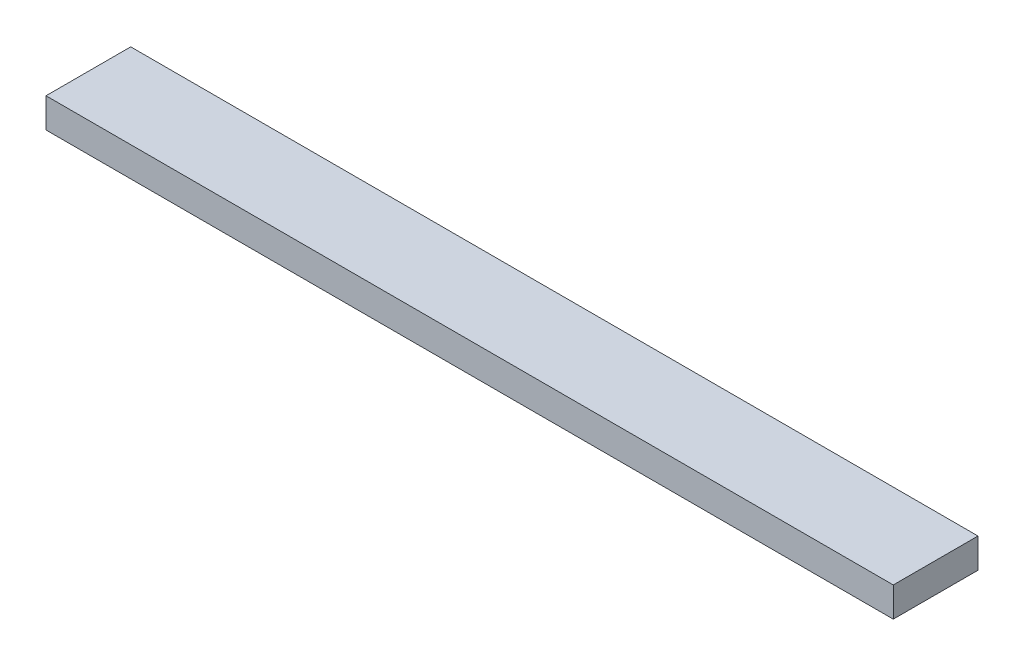
ISO-10303-21;
HEADER;
FILE_DESCRIPTION(('STEP AP214'),'2;1');
FILE_NAME('part.step','',(''),(''),'','','');
FILE_SCHEMA(('AUTOMOTIVE_DESIGN { 1 0 10303 214 1 1 1 1 }'));
ENDSEC;
DATA;
#1=APPLICATION_CONTEXT('core data for automotive mechanical design processes');
#2=APPLICATION_PROTOCOL_DEFINITION('international standard','automotive_design',2000,#1);
#3=PRODUCT_CONTEXT('',#1,'mechanical');
#4=PRODUCT('Part','Part','',(#3));
#5=PRODUCT_RELATED_PRODUCT_CATEGORY('part','',(#4));
#6=PRODUCT_DEFINITION_FORMATION('','',#4);
#7=PRODUCT_DEFINITION_CONTEXT('part definition',#1,'design');
#8=PRODUCT_DEFINITION('design','',#6,#7);
#9=PRODUCT_DEFINITION_SHAPE('','',#8);
#10=(LENGTH_UNIT() NAMED_UNIT(*) SI_UNIT(.MILLI.,.METRE.));
#11=(NAMED_UNIT(*) PLANE_ANGLE_UNIT() SI_UNIT($,.RADIAN.));
#12=(NAMED_UNIT(*) SI_UNIT($,.STERADIAN.) SOLID_ANGLE_UNIT());
#13=UNCERTAINTY_MEASURE_WITH_UNIT(LENGTH_MEASURE(1.E-05),#10,'distance_accuracy_value','');
#14=(GEOMETRIC_REPRESENTATION_CONTEXT(3) GLOBAL_UNCERTAINTY_ASSIGNED_CONTEXT((#13)) GLOBAL_UNIT_ASSIGNED_CONTEXT((#10,
#11,#12)) REPRESENTATION_CONTEXT('',''));
#15=CARTESIAN_POINT('',(0.,0.,0.));
#16=DIRECTION('',(0.,0.,1.));
#17=DIRECTION('',(1.,0.,0.));
#18=AXIS2_PLACEMENT_3D('',#15,#16,#17);
#19=CARTESIAN_POINT('',(10.,0.7,1.));
#20=DIRECTION('',(-1.,0.,0.));
#21=DIRECTION('',(0.,0.,1.));
#22=AXIS2_PLACEMENT_3D('',#19,#20,#21);
#23=PLANE('',#22);
#24=DIRECTION('',(0.,0.,-1.));
#25=VECTOR('',#24,1.);
#26=CARTESIAN_POINT('',(10.,0.,1.));
#27=LINE('',#26,#25);
#28=CARTESIAN_POINT('',(10.,0.,1.));
#29=VERTEX_POINT('',#28);
#30=CARTESIAN_POINT('',(10.,0.,-1.));
#31=VERTEX_POINT('',#30);
#32=EDGE_CURVE('E96',#29,#31,#27,.T.);
#33=ORIENTED_EDGE('',*,*,#32,.T.);
#34=DIRECTION('',(0.,-1.,0.));
#35=VECTOR('',#34,1.);
#36=CARTESIAN_POINT('',(10.,0.7,-1.));
#37=LINE('',#36,#35);
#38=CARTESIAN_POINT('',(10.,0.7,-1.));
#39=VERTEX_POINT('',#38);
#40=EDGE_CURVE('E11',#39,#31,#37,.T.);
#41=ORIENTED_EDGE('',*,*,#40,.F.);
#42=DIRECTION('',(0.,0.,-1.));
#43=VECTOR('',#42,1.);
#44=CARTESIAN_POINT('',(10.,0.7,1.));
#45=LINE('',#44,#43);
#46=CARTESIAN_POINT('',(10.,0.7,1.));
#47=VERTEX_POINT('',#46);
#48=EDGE_CURVE('E84',#47,#39,#45,.T.);
#49=ORIENTED_EDGE('',*,*,#48,.F.);
#50=DIRECTION('',(0.,-1.,0.));
#51=VECTOR('',#50,1.);
#52=CARTESIAN_POINT('',(10.,0.7,1.));
#53=LINE('',#52,#51);
#54=EDGE_CURVE('E92',#47,#29,#53,.T.);
#55=ORIENTED_EDGE('',*,*,#54,.T.);
#56=EDGE_LOOP('',(#33,#41,#49,#55));
#57=FACE_BOUND('',#56,.T.);
#58=ADVANCED_FACE('F33',(#57),#23,.F.);
#59=CARTESIAN_POINT('',(-9.99999999999999,0.7,-1.));
#60=DIRECTION('',(0.,0.,1.));
#61=DIRECTION('',(1.,0.,0.));
#62=AXIS2_PLACEMENT_3D('',#59,#60,#61);
#63=PLANE('',#62);
#64=DIRECTION('',(-1.,0.,0.));
#65=VECTOR('',#64,1.);
#66=CARTESIAN_POINT('',(-9.99999999999999,0.,-1.));
#67=LINE('',#66,#65);
#68=CARTESIAN_POINT('',(-9.99999999999999,0.,-1.));
#69=VERTEX_POINT('',#68);
#70=EDGE_CURVE('E88',#31,#69,#67,.T.);
#71=ORIENTED_EDGE('',*,*,#70,.T.);
#72=DIRECTION('',(0.,-1.,0.));
#73=VECTOR('',#72,1.);
#74=CARTESIAN_POINT('',(-9.99999999999999,0.7,-1.));
#75=LINE('',#74,#73);
#76=CARTESIAN_POINT('',(-9.99999999999999,0.7,-1.));
#77=VERTEX_POINT('',#76);
#78=EDGE_CURVE('E41',#77,#69,#75,.T.);
#79=ORIENTED_EDGE('',*,*,#78,.F.);
#80=DIRECTION('',(-1.,0.,0.));
#81=VECTOR('',#80,1.);
#82=CARTESIAN_POINT('',(-9.99999999999999,0.7,-1.));
#83=LINE('',#82,#81);
#84=EDGE_CURVE('E79',#39,#77,#83,.T.);
#85=ORIENTED_EDGE('',*,*,#84,.F.);
#86=ORIENTED_EDGE('',*,*,#40,.T.);
#87=EDGE_LOOP('',(#71,#79,#85,#86));
#88=FACE_BOUND('',#87,.T.);
#89=ADVANCED_FACE('F87',(#88),#63,.F.);
#90=CARTESIAN_POINT('',(-9.99999999999999,0.7,1.));
#91=DIRECTION('',(1.,0.,0.));
#92=DIRECTION('',(0.,0.,-1.));
#93=AXIS2_PLACEMENT_3D('',#90,#91,#92);
#94=PLANE('',#93);
#95=DIRECTION('',(0.,0.,1.));
#96=VECTOR('',#95,1.);
#97=CARTESIAN_POINT('',(-9.99999999999999,0.,1.));
#98=LINE('',#97,#96);
#99=CARTESIAN_POINT('',(-9.99999999999999,0.,1.));
#100=VERTEX_POINT('',#99);
#101=EDGE_CURVE('E66',#69,#100,#98,.T.);
#102=ORIENTED_EDGE('',*,*,#101,.T.);
#103=DIRECTION('',(0.,-1.,0.));
#104=VECTOR('',#103,1.);
#105=CARTESIAN_POINT('',(-9.99999999999999,0.7,1.));
#106=LINE('',#105,#104);
#107=CARTESIAN_POINT('',(-9.99999999999999,0.7,1.));
#108=VERTEX_POINT('',#107);
#109=EDGE_CURVE('E89',#108,#100,#106,.T.);
#110=ORIENTED_EDGE('',*,*,#109,.F.);
#111=DIRECTION('',(0.,0.,1.));
#112=VECTOR('',#111,1.);
#113=CARTESIAN_POINT('',(-9.99999999999999,0.7,1.));
#114=LINE('',#113,#112);
#115=EDGE_CURVE('E82',#77,#108,#114,.T.);
#116=ORIENTED_EDGE('',*,*,#115,.F.);
#117=ORIENTED_EDGE('',*,*,#78,.T.);
#118=EDGE_LOOP('',(#102,#110,#116,#117));
#119=FACE_BOUND('',#118,.T.);
#120=ADVANCED_FACE('F90',(#119),#94,.F.);
#121=CARTESIAN_POINT('',(-9.99999999999999,0.7,1.));
#122=DIRECTION('',(0.,0.,-1.));
#123=DIRECTION('',(-1.,0.,0.));
#124=AXIS2_PLACEMENT_3D('',#121,#122,#123);
#125=PLANE('',#124);
#126=DIRECTION('',(1.,0.,0.));
#127=VECTOR('',#126,1.);
#128=CARTESIAN_POINT('',(-9.99999999999999,0.,1.));
#129=LINE('',#128,#127);
#130=EDGE_CURVE('E72',#100,#29,#129,.T.);
#131=ORIENTED_EDGE('',*,*,#130,.T.);
#132=ORIENTED_EDGE('',*,*,#54,.F.);
#133=DIRECTION('',(1.,0.,0.));
#134=VECTOR('',#133,1.);
#135=CARTESIAN_POINT('',(-9.99999999999999,0.7,1.));
#136=LINE('',#135,#134);
#137=EDGE_CURVE('E49',#108,#47,#136,.T.);
#138=ORIENTED_EDGE('',*,*,#137,.F.);
#139=ORIENTED_EDGE('',*,*,#109,.T.);
#140=EDGE_LOOP('',(#131,#132,#138,#139));
#141=FACE_BOUND('',#140,.T.);
#142=ADVANCED_FACE('F103',(#141),#125,.F.);
#143=CARTESIAN_POINT('',(0.,0.7,0.));
#144=DIRECTION('',(0.,-1.,0.));
#145=DIRECTION('',(0.,0.,-1.));
#146=AXIS2_PLACEMENT_3D('',#143,#144,#145);
#147=PLANE('',#146);
#148=ORIENTED_EDGE('',*,*,#48,.T.);
#149=ORIENTED_EDGE('',*,*,#84,.T.);
#150=ORIENTED_EDGE('',*,*,#115,.T.);
#151=ORIENTED_EDGE('',*,*,#137,.T.);
#152=EDGE_LOOP('',(#148,#149,#150,#151));
#153=FACE_BOUND('',#152,.T.);
#154=ADVANCED_FACE('F80',(#153),#147,.F.);
#155=CARTESIAN_POINT('',(0.,0.,0.));
#156=DIRECTION('',(0.,-1.,0.));
#157=DIRECTION('',(0.,0.,-1.));
#158=AXIS2_PLACEMENT_3D('',#155,#156,#157);
#159=PLANE('',#158);
#160=ORIENTED_EDGE('',*,*,#32,.F.);
#161=ORIENTED_EDGE('',*,*,#130,.F.);
#162=ORIENTED_EDGE('',*,*,#101,.F.);
#163=ORIENTED_EDGE('',*,*,#70,.F.);
#164=EDGE_LOOP('',(#160,#161,#162,#163));
#165=FACE_BOUND('',#164,.T.);
#166=ADVANCED_FACE('F106',(#165),#159,.T.);
#167=CLOSED_SHELL('',(#58,#89,#120,#142,#154,#166));
#168=MANIFOLD_SOLID_BREP('B2',#167);
#169=ADVANCED_BREP_SHAPE_REPRESENTATION('',(#18,#168),#14);
#170=SHAPE_DEFINITION_REPRESENTATION(#9,#169);
ENDSEC;
END-ISO-10303-21;
